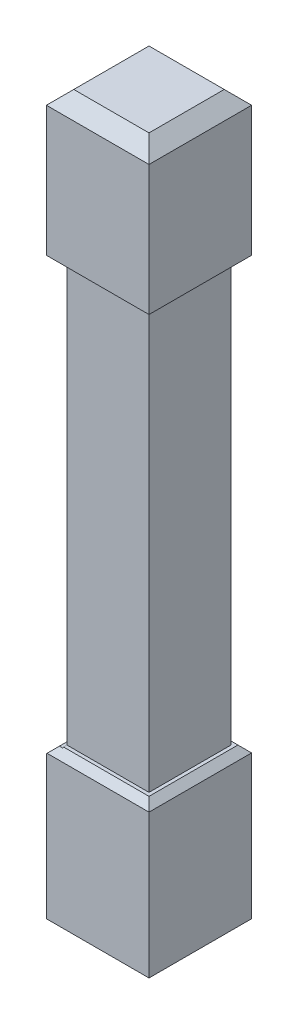
ISO-10303-21;
HEADER;
FILE_DESCRIPTION(('STEP AP214'),'2;1');
FILE_NAME('part.step','',(''),(''),'','','');
FILE_SCHEMA(('AUTOMOTIVE_DESIGN { 1 0 10303 214 1 1 1 1 }'));
ENDSEC;
DATA;
#1=APPLICATION_CONTEXT('core data for automotive mechanical design processes');
#2=APPLICATION_PROTOCOL_DEFINITION('international standard','automotive_design',2000,#1);
#3=PRODUCT_CONTEXT('',#1,'mechanical');
#4=PRODUCT('Part','Part','',(#3));
#5=PRODUCT_RELATED_PRODUCT_CATEGORY('part','',(#4));
#6=PRODUCT_DEFINITION_FORMATION('','',#4);
#7=PRODUCT_DEFINITION_CONTEXT('part definition',#1,'design');
#8=PRODUCT_DEFINITION('design','',#6,#7);
#9=PRODUCT_DEFINITION_SHAPE('','',#8);
#10=(LENGTH_UNIT() NAMED_UNIT(*) SI_UNIT(.MILLI.,.METRE.));
#11=(NAMED_UNIT(*) PLANE_ANGLE_UNIT() SI_UNIT($,.RADIAN.));
#12=(NAMED_UNIT(*) SI_UNIT($,.STERADIAN.) SOLID_ANGLE_UNIT());
#13=UNCERTAINTY_MEASURE_WITH_UNIT(LENGTH_MEASURE(1.E-05),#10,'distance_accuracy_value','');
#14=(GEOMETRIC_REPRESENTATION_CONTEXT(3) GLOBAL_UNCERTAINTY_ASSIGNED_CONTEXT((#13)) GLOBAL_UNIT_ASSIGNED_CONTEXT((#10,
#11,#12)) REPRESENTATION_CONTEXT('',''));
#15=CARTESIAN_POINT('',(0.,0.,0.));
#16=DIRECTION('',(0.,0.,1.));
#17=DIRECTION('',(1.,0.,0.));
#18=AXIS2_PLACEMENT_3D('',#15,#16,#17);
#19=CARTESIAN_POINT('',(0.,0.,150.));
#20=DIRECTION('',(0.,0.,-1.));
#21=DIRECTION('',(-1.,0.,0.));
#22=AXIS2_PLACEMENT_3D('',#19,#20,#21);
#23=PLANE('',#22);
#24=DIRECTION('',(0.,-1.,0.));
#25=VECTOR('',#24,1.);
#26=CARTESIAN_POINT('',(-75.,685.50971446118,150.));
#27=LINE('',#26,#25);
#28=CARTESIAN_POINT('',(-75.,665.50971446118,150.));
#29=VERTEX_POINT('',#28);
#30=CARTESIAN_POINT('',(-75.,475.50971446118,150.));
#31=VERTEX_POINT('',#30);
#32=EDGE_CURVE('E231',#29,#31,#27,.T.);
#33=ORIENTED_EDGE('',*,*,#32,.T.);
#34=DIRECTION('',(1.,0.,0.));
#35=VECTOR('',#34,1.);
#36=CARTESIAN_POINT('',(75.,475.50971446118,150.));
#37=LINE('',#36,#35);
#38=CARTESIAN_POINT('',(75.,475.50971446118,150.));
#39=VERTEX_POINT('',#38);
#40=EDGE_CURVE('E266',#31,#39,#37,.T.);
#41=ORIENTED_EDGE('',*,*,#40,.T.);
#42=DIRECTION('',(0.,-1.,0.));
#43=VECTOR('',#42,1.);
#44=CARTESIAN_POINT('',(75.,685.50971446118,150.));
#45=LINE('',#44,#43);
#46=CARTESIAN_POINT('',(75.,665.50971446118,150.));
#47=VERTEX_POINT('',#46);
#48=EDGE_CURVE('E220',#47,#39,#45,.T.);
#49=ORIENTED_EDGE('',*,*,#48,.F.);
#50=DIRECTION('',(-1.,0.,0.));
#51=VECTOR('',#50,1.);
#52=CARTESIAN_POINT('',(0.,665.50971446118,150.));
#53=LINE('',#52,#51);
#54=EDGE_CURVE('E264',#47,#29,#53,.T.);
#55=ORIENTED_EDGE('',*,*,#54,.T.);
#56=EDGE_LOOP('',(#33,#41,#49,#55));
#57=FACE_BOUND('',#56,.T.);
#58=ADVANCED_FACE('F33',(#57),#23,.F.);
#59=CARTESIAN_POINT('',(59.9999999999999,0.,0.));
#60=DIRECTION('',(-1.,0.,0.));
#61=DIRECTION('',(0.,-1.,0.));
#62=AXIS2_PLACEMENT_3D('',#59,#60,#61);
#63=PLANE('',#62);
#64=DIRECTION('',(0.,1.,0.));
#65=VECTOR('',#64,1.);
#66=CARTESIAN_POINT('',(59.9999999999999,0.,135.));
#67=LINE('',#66,#65);
#68=CARTESIAN_POINT('',(59.9999999999999,-144.49028553882,135.));
#69=VERTEX_POINT('',#68);
#70=CARTESIAN_POINT('',(59.9999999999999,465.50971446118,135.));
#71=VERTEX_POINT('',#70);
#72=EDGE_CURVE('E174',#69,#71,#67,.T.);
#73=ORIENTED_EDGE('',*,*,#72,.F.);
#74=DIRECTION('',(0.,0.,-1.));
#75=VECTOR('',#74,1.);
#76=CARTESIAN_POINT('',(59.9999999999999,-144.49028553882,0.));
#77=LINE('',#76,#75);
#78=CARTESIAN_POINT('',(59.9999999999999,-144.49028553882,15.));
#79=VERTEX_POINT('',#78);
#80=EDGE_CURVE('E200',#69,#79,#77,.T.);
#81=ORIENTED_EDGE('',*,*,#80,.T.);
#82=DIRECTION('',(0.,-1.,0.));
#83=VECTOR('',#82,1.);
#84=CARTESIAN_POINT('',(59.9999999999999,0.,15.));
#85=LINE('',#84,#83);
#86=CARTESIAN_POINT('',(60.,465.50971446118,15.));
#87=VERTEX_POINT('',#86);
#88=EDGE_CURVE('E199',#87,#79,#85,.T.);
#89=ORIENTED_EDGE('',*,*,#88,.F.);
#90=DIRECTION('',(0.,0.,1.));
#91=VECTOR('',#90,1.);
#92=CARTESIAN_POINT('',(60.,465.50971446118,0.));
#93=LINE('',#92,#91);
#94=EDGE_CURVE('E192',#87,#71,#93,.T.);
#95=ORIENTED_EDGE('',*,*,#94,.T.);
#96=EDGE_LOOP('',(#73,#81,#89,#95));
#97=FACE_BOUND('',#96,.T.);
#98=ADVANCED_FACE('F197',(#97),#63,.F.);
#99=CARTESIAN_POINT('',(75.,685.50971446118,150.));
#100=DIRECTION('',(1.,0.,0.));
#101=DIRECTION('',(0.,1.,0.));
#102=AXIS2_PLACEMENT_3D('',#99,#100,#101);
#103=PLANE('',#102);
#104=DIRECTION('',(0.,-1.,0.));
#105=VECTOR('',#104,1.);
#106=CARTESIAN_POINT('',(75.,685.50971446118,0.));
#107=LINE('',#106,#105);
#108=CARTESIAN_POINT('',(74.9999999999999,-154.49028553882,0.));
#109=VERTEX_POINT('',#108);
#110=CARTESIAN_POINT('',(74.9999999999999,-364.49028553882,0.));
#111=VERTEX_POINT('',#110);
#112=EDGE_CURVE('E219',#109,#111,#107,.T.);
#113=ORIENTED_EDGE('',*,*,#112,.F.);
#114=DIRECTION('',(0.,0.,1.));
#115=VECTOR('',#114,1.);
#116=CARTESIAN_POINT('',(74.9999999999999,-154.49028553882,150.));
#117=LINE('',#116,#115);
#118=CARTESIAN_POINT('',(74.9999999999999,-154.49028553882,150.));
#119=VERTEX_POINT('',#118);
#120=EDGE_CURVE('E11',#109,#119,#117,.T.);
#121=ORIENTED_EDGE('',*,*,#120,.T.);
#122=CARTESIAN_POINT('',(74.9999999999999,-364.49028553882,150.));
#123=VERTEX_POINT('',#122);
#124=EDGE_CURVE('E224',#119,#123,#45,.T.);
#125=ORIENTED_EDGE('',*,*,#124,.T.);
#126=DIRECTION('',(0.,0.,-1.));
#127=VECTOR('',#126,1.);
#128=CARTESIAN_POINT('',(74.9999999999999,-364.49028553882,150.));
#129=LINE('',#128,#127);
#130=EDGE_CURVE('E223',#123,#111,#129,.T.);
#131=ORIENTED_EDGE('',*,*,#130,.T.);
#132=EDGE_LOOP('',(#113,#121,#125,#131));
#133=FACE_BOUND('',#132,.T.);
#134=ADVANCED_FACE('F351',(#133),#103,.T.);
#135=CARTESIAN_POINT('',(-75.,685.50971446118,150.));
#136=DIRECTION('',(1.,0.,0.));
#137=DIRECTION('',(0.,1.,0.));
#138=AXIS2_PLACEMENT_3D('',#135,#136,#137);
#139=PLANE('',#138);
#140=DIRECTION('',(0.,-1.,0.));
#141=VECTOR('',#140,1.);
#142=CARTESIAN_POINT('',(-75.,685.50971446118,0.));
#143=LINE('',#142,#141);
#144=CARTESIAN_POINT('',(-75.,665.50971446118,0.));
#145=VERTEX_POINT('',#144);
#146=CARTESIAN_POINT('',(-75.,475.50971446118,0.));
#147=VERTEX_POINT('',#146);
#148=EDGE_CURVE('E239',#145,#147,#143,.T.);
#149=ORIENTED_EDGE('',*,*,#148,.T.);
#150=DIRECTION('',(0.,0.,1.));
#151=VECTOR('',#150,1.);
#152=CARTESIAN_POINT('',(-75.,475.50971446118,150.));
#153=LINE('',#152,#151);
#154=EDGE_CURVE('E289',#147,#31,#153,.T.);
#155=ORIENTED_EDGE('',*,*,#154,.T.);
#156=ORIENTED_EDGE('',*,*,#32,.F.);
#157=DIRECTION('',(0.,0.,-1.));
#158=VECTOR('',#157,1.);
#159=CARTESIAN_POINT('',(-75.,665.50971446118,150.));
#160=LINE('',#159,#158);
#161=EDGE_CURVE('E184',#29,#145,#160,.T.);
#162=ORIENTED_EDGE('',*,*,#161,.T.);
#163=EDGE_LOOP('',(#149,#155,#156,#162));
#164=FACE_BOUND('',#163,.T.);
#165=ADVANCED_FACE('F375',(#164),#139,.F.);
#166=CARTESIAN_POINT('',(-113.466713426682,-144.49028553882,15.));
#167=DIRECTION('',(0.,1.,0.));
#168=DIRECTION('',(0.,0.,1.));
#169=AXIS2_PLACEMENT_3D('',#166,#167,#168);
#170=PLANE('',#169);
#171=DIRECTION('',(0.,0.,1.));
#172=VECTOR('',#171,1.);
#173=CARTESIAN_POINT('',(-59.9999999999999,-144.49028553882,0.));
#174=LINE('',#173,#172);
#175=CARTESIAN_POINT('',(-59.9999999999999,-144.49028553882,135.));
#176=VERTEX_POINT('',#175);
#177=CARTESIAN_POINT('',(-59.9999999999999,-144.49028553882,140.));
#178=VERTEX_POINT('',#177);
#179=EDGE_CURVE('E201',#176,#178,#174,.T.);
#180=ORIENTED_EDGE('',*,*,#179,.T.);
#181=DIRECTION('',(1.,0.,0.));
#182=VECTOR('',#181,1.);
#183=CARTESIAN_POINT('',(74.9999999999999,-144.49028553882,140.));
#184=LINE('',#183,#182);
#185=CARTESIAN_POINT('',(65.,-144.49028553882,140.));
#186=VERTEX_POINT('',#185);
#187=EDGE_CURVE('E42',#178,#186,#184,.T.);
#188=ORIENTED_EDGE('',*,*,#187,.T.);
#189=DIRECTION('',(0.,0.,-1.));
#190=VECTOR('',#189,1.);
#191=CARTESIAN_POINT('',(65.,-144.49028553882,15.));
#192=LINE('',#191,#190);
#193=CARTESIAN_POINT('',(65.,-144.49028553882,9.9999999999999));
#194=VERTEX_POINT('',#193);
#195=EDGE_CURVE('E50',#186,#194,#192,.T.);
#196=ORIENTED_EDGE('',*,*,#195,.T.);
#197=DIRECTION('',(-1.,0.,0.));
#198=VECTOR('',#197,1.);
#199=CARTESIAN_POINT('',(-113.466713426682,-144.49028553882,9.9999999999999));
#200=LINE('',#199,#198);
#201=CARTESIAN_POINT('',(-59.9999999999999,-144.49028553882,9.99999999999988));
#202=VERTEX_POINT('',#201);
#203=EDGE_CURVE('E327',#194,#202,#200,.T.);
#204=ORIENTED_EDGE('',*,*,#203,.T.);
#205=DIRECTION('',(0.,0.,1.));
#206=VECTOR('',#205,1.);
#207=CARTESIAN_POINT('',(-59.9999999999999,-144.49028553882,15.));
#208=LINE('',#207,#206);
#209=CARTESIAN_POINT('',(-59.9999999999999,-144.49028553882,15.));
#210=VERTEX_POINT('',#209);
#211=EDGE_CURVE('E212',#202,#210,#208,.T.);
#212=ORIENTED_EDGE('',*,*,#211,.T.);
#213=DIRECTION('',(1.,0.,0.));
#214=VECTOR('',#213,1.);
#215=CARTESIAN_POINT('',(-113.466713426682,-144.49028553882,15.));
#216=LINE('',#215,#214);
#217=EDGE_CURVE('E214',#210,#79,#216,.T.);
#218=ORIENTED_EDGE('',*,*,#217,.T.);
#219=ORIENTED_EDGE('',*,*,#80,.F.);
#220=DIRECTION('',(1.,0.,0.));
#221=VECTOR('',#220,1.);
#222=CARTESIAN_POINT('',(-75.,-144.49028553882,135.));
#223=LINE('',#222,#221);
#224=EDGE_CURVE('E180',#176,#69,#223,.T.);
#225=ORIENTED_EDGE('',*,*,#224,.F.);
#226=EDGE_LOOP('',(#180,#188,#196,#204,#212,#218,#219,#225));
#227=FACE_BOUND('',#226,.T.);
#228=ADVANCED_FACE('F382',(#227),#170,.T.);
#229=CARTESIAN_POINT('',(0.,0.,15.));
#230=DIRECTION('',(0.,0.,1.));
#231=DIRECTION('',(1.,0.,0.));
#232=AXIS2_PLACEMENT_3D('',#229,#230,#231);
#233=PLANE('',#232);
#234=DIRECTION('',(-1.,0.,0.));
#235=VECTOR('',#234,1.);
#236=CARTESIAN_POINT('',(-113.466713426682,465.50971446118,15.));
#237=LINE('',#236,#235);
#238=CARTESIAN_POINT('',(-59.9999999999999,465.50971446118,15.));
#239=VERTEX_POINT('',#238);
#240=EDGE_CURVE('E217',#87,#239,#237,.T.);
#241=ORIENTED_EDGE('',*,*,#240,.F.);
#242=ORIENTED_EDGE('',*,*,#88,.T.);
#243=ORIENTED_EDGE('',*,*,#217,.F.);
#244=DIRECTION('',(0.,-1.,0.));
#245=VECTOR('',#244,1.);
#246=CARTESIAN_POINT('',(-59.9999999999999,0.,15.));
#247=LINE('',#246,#245);
#248=EDGE_CURVE('E185',#239,#210,#247,.T.);
#249=ORIENTED_EDGE('',*,*,#248,.F.);
#250=EDGE_LOOP('',(#241,#242,#243,#249));
#251=FACE_BOUND('',#250,.T.);
#252=ADVANCED_FACE('F373',(#251),#233,.F.);
#253=CARTESIAN_POINT('',(-74.9999999999999,-155.454753629386,150.));
#254=VERTEX_POINT('',#253);
#255=CARTESIAN_POINT('',(-74.9999999999999,-364.49028553882,150.));
#256=VERTEX_POINT('',#255);
#257=EDGE_CURVE('E235',#254,#256,#27,.T.);
#258=ORIENTED_EDGE('',*,*,#257,.F.);
#259=DIRECTION('',(0.,0.,-1.));
#260=VECTOR('',#259,1.);
#261=CARTESIAN_POINT('',(-74.9999999999999,-155.454753629386,150.));
#262=LINE('',#261,#260);
#263=CARTESIAN_POINT('',(-74.9999999999999,-155.454753629386,0.));
#264=VERTEX_POINT('',#263);
#265=EDGE_CURVE('E315',#254,#264,#262,.T.);
#266=ORIENTED_EDGE('',*,*,#265,.T.);
#267=CARTESIAN_POINT('',(-74.9999999999999,-364.49028553882,0.));
#268=VERTEX_POINT('',#267);
#269=EDGE_CURVE('E230',#264,#268,#143,.T.);
#270=ORIENTED_EDGE('',*,*,#269,.T.);
#271=DIRECTION('',(0.,0.,-1.));
#272=VECTOR('',#271,1.);
#273=CARTESIAN_POINT('',(-74.9999999999999,-364.49028553882,150.));
#274=LINE('',#273,#272);
#275=EDGE_CURVE('E238',#256,#268,#274,.T.);
#276=ORIENTED_EDGE('',*,*,#275,.F.);
#277=EDGE_LOOP('',(#258,#266,#270,#276));
#278=FACE_BOUND('',#277,.T.);
#279=ADVANCED_FACE('F371',(#278),#139,.F.);
#280=CARTESIAN_POINT('',(0.,0.,0.));
#281=DIRECTION('',(0.,0.,-1.));
#282=DIRECTION('',(-1.,0.,0.));
#283=AXIS2_PLACEMENT_3D('',#280,#281,#282);
#284=PLANE('',#283);
#285=ORIENTED_EDGE('',*,*,#269,.F.);
#286=DIRECTION('',(-0.707106781186544,-0.707106781186551,0.));
#287=VECTOR('',#286,1.);
#288=CARTESIAN_POINT('',(40.2273768146925,-40.2273768146921,0.));
#289=LINE('',#288,#287);
#290=CARTESIAN_POINT('',(-74.0355319094341,-154.49028553882,0.));
#291=VERTEX_POINT('',#290);
#292=EDGE_CURVE('E320',#264,#291,#289,.F.);
#293=ORIENTED_EDGE('',*,*,#292,.T.);
#294=DIRECTION('',(1.,0.,0.));
#295=VECTOR('',#294,1.);
#296=CARTESIAN_POINT('',(0.,-154.49028553882,0.));
#297=LINE('',#296,#295);
#298=EDGE_CURVE('E318',#291,#109,#297,.T.);
#299=ORIENTED_EDGE('',*,*,#298,.T.);
#300=ORIENTED_EDGE('',*,*,#112,.T.);
#301=DIRECTION('',(1.,0.,0.));
#302=VECTOR('',#301,1.);
#303=CARTESIAN_POINT('',(0.,-364.49028553882,0.));
#304=LINE('',#303,#302);
#305=EDGE_CURVE('E242',#268,#111,#304,.T.);
#306=ORIENTED_EDGE('',*,*,#305,.F.);
#307=EDGE_LOOP('',(#285,#293,#299,#300,#306));
#308=FACE_BOUND('',#307,.T.);
#309=ADVANCED_FACE('F364',(#308),#284,.T.);
#310=CARTESIAN_POINT('',(75.,665.50971446118,0.));
#311=VERTEX_POINT('',#310);
#312=CARTESIAN_POINT('',(75.,475.50971446118,0.));
#313=VERTEX_POINT('',#312);
#314=EDGE_CURVE('E225',#311,#313,#107,.T.);
#315=ORIENTED_EDGE('',*,*,#314,.T.);
#316=DIRECTION('',(-1.,0.,0.));
#317=VECTOR('',#316,1.);
#318=CARTESIAN_POINT('',(0.,475.50971446118,0.));
#319=LINE('',#318,#317);
#320=EDGE_CURVE('E291',#313,#147,#319,.T.);
#321=ORIENTED_EDGE('',*,*,#320,.T.);
#322=ORIENTED_EDGE('',*,*,#148,.F.);
#323=DIRECTION('',(1.,0.,0.));
#324=VECTOR('',#323,1.);
#325=CARTESIAN_POINT('',(75.,665.50971446118,0.));
#326=LINE('',#325,#324);
#327=EDGE_CURVE('E260',#145,#311,#326,.T.);
#328=ORIENTED_EDGE('',*,*,#327,.T.);
#329=EDGE_LOOP('',(#315,#321,#322,#328));
#330=FACE_BOUND('',#329,.T.);
#331=ADVANCED_FACE('F380',(#330),#284,.T.);
#332=ORIENTED_EDGE('',*,*,#48,.T.);
#333=DIRECTION('',(0.,0.,-1.));
#334=VECTOR('',#333,1.);
#335=CARTESIAN_POINT('',(75.,475.50971446118,150.));
#336=LINE('',#335,#334);
#337=EDGE_CURVE('E293',#39,#313,#336,.T.);
#338=ORIENTED_EDGE('',*,*,#337,.T.);
#339=ORIENTED_EDGE('',*,*,#314,.F.);
#340=DIRECTION('',(0.,0.,1.));
#341=VECTOR('',#340,1.);
#342=CARTESIAN_POINT('',(75.,665.50971446118,150.));
#343=LINE('',#342,#341);
#344=EDGE_CURVE('E262',#311,#47,#343,.T.);
#345=ORIENTED_EDGE('',*,*,#344,.T.);
#346=EDGE_LOOP('',(#332,#338,#339,#345));
#347=FACE_BOUND('',#346,.T.);
#348=ADVANCED_FACE('F409',(#347),#103,.T.);
#349=CARTESIAN_POINT('',(0.,685.50971446118,150.));
#350=DIRECTION('',(0.,-1.,0.));
#351=DIRECTION('',(0.,0.,-1.));
#352=AXIS2_PLACEMENT_3D('',#349,#350,#351);
#353=PLANE('',#352);
#354=DIRECTION('',(-1.,0.,0.));
#355=VECTOR('',#354,1.);
#356=CARTESIAN_POINT('',(-75.,685.50971446118,20.));
#357=LINE('',#356,#355);
#358=CARTESIAN_POINT('',(55.,685.50971446118,20.));
#359=VERTEX_POINT('',#358);
#360=CARTESIAN_POINT('',(-55.,685.50971446118,20.));
#361=VERTEX_POINT('',#360);
#362=EDGE_CURVE('E255',#359,#361,#357,.T.);
#363=ORIENTED_EDGE('',*,*,#362,.T.);
#364=DIRECTION('',(0.,0.,1.));
#365=VECTOR('',#364,1.);
#366=CARTESIAN_POINT('',(-55.,685.50971446118,150.));
#367=LINE('',#366,#365);
#368=CARTESIAN_POINT('',(-55.,685.50971446118,130.));
#369=VERTEX_POINT('',#368);
#370=EDGE_CURVE('E257',#361,#369,#367,.T.);
#371=ORIENTED_EDGE('',*,*,#370,.T.);
#372=DIRECTION('',(1.,0.,0.));
#373=VECTOR('',#372,1.);
#374=CARTESIAN_POINT('',(0.,685.50971446118,130.));
#375=LINE('',#374,#373);
#376=CARTESIAN_POINT('',(55.,685.50971446118,130.));
#377=VERTEX_POINT('',#376);
#378=EDGE_CURVE('E251',#369,#377,#375,.T.);
#379=ORIENTED_EDGE('',*,*,#378,.T.);
#380=DIRECTION('',(0.,0.,-1.));
#381=VECTOR('',#380,1.);
#382=CARTESIAN_POINT('',(55.,685.50971446118,0.));
#383=LINE('',#382,#381);
#384=EDGE_CURVE('E253',#377,#359,#383,.T.);
#385=ORIENTED_EDGE('',*,*,#384,.T.);
#386=EDGE_LOOP('',(#363,#371,#379,#385));
#387=FACE_BOUND('',#386,.T.);
#388=ADVANCED_FACE('F405',(#387),#353,.F.);
#389=CARTESIAN_POINT('',(0.,-364.49028553882,150.));
#390=DIRECTION('',(0.,1.,0.));
#391=DIRECTION('',(-1.,0.,0.));
#392=AXIS2_PLACEMENT_3D('',#389,#390,#391);
#393=PLANE('',#392);
#394=ORIENTED_EDGE('',*,*,#305,.T.);
#395=ORIENTED_EDGE('',*,*,#130,.F.);
#396=DIRECTION('',(1.,0.,0.));
#397=VECTOR('',#396,1.);
#398=CARTESIAN_POINT('',(0.,-364.49028553882,150.));
#399=LINE('',#398,#397);
#400=EDGE_CURVE('E234',#256,#123,#399,.T.);
#401=ORIENTED_EDGE('',*,*,#400,.F.);
#402=ORIENTED_EDGE('',*,*,#275,.T.);
#403=EDGE_LOOP('',(#394,#395,#401,#402));
#404=FACE_BOUND('',#403,.T.);
#405=ADVANCED_FACE('F360',(#404),#393,.F.);
#406=DIRECTION('',(-1.,0.,0.));
#407=VECTOR('',#406,1.);
#408=CARTESIAN_POINT('',(-59.9999999999999,-154.49028553882,150.));
#409=LINE('',#408,#407);
#410=CARTESIAN_POINT('',(-74.0355319094341,-154.49028553882,150.));
#411=VERTEX_POINT('',#410);
#412=EDGE_CURVE('E311',#119,#411,#409,.T.);
#413=ORIENTED_EDGE('',*,*,#412,.T.);
#414=DIRECTION('',(0.707106781186544,0.707106781186551,0.));
#415=VECTOR('',#414,1.);
#416=CARTESIAN_POINT('',(-65.,-145.454753629386,150.));
#417=LINE('',#416,#415);
#418=EDGE_CURVE('E313',#411,#254,#417,.F.);
#419=ORIENTED_EDGE('',*,*,#418,.T.);
#420=ORIENTED_EDGE('',*,*,#257,.T.);
#421=ORIENTED_EDGE('',*,*,#400,.T.);
#422=ORIENTED_EDGE('',*,*,#124,.F.);
#423=EDGE_LOOP('',(#413,#419,#420,#421,#422));
#424=FACE_BOUND('',#423,.T.);
#425=ADVANCED_FACE('F353',(#424),#23,.F.);
#426=CARTESIAN_POINT('',(-113.466713426682,465.50971446118,15.));
#427=DIRECTION('',(0.,-1.,0.));
#428=DIRECTION('',(0.,0.,-1.));
#429=AXIS2_PLACEMENT_3D('',#426,#427,#428);
#430=PLANE('',#429);
#431=DIRECTION('',(0.,0.,1.));
#432=VECTOR('',#431,1.);
#433=CARTESIAN_POINT('',(64.9999999999998,465.50971446118,15.));
#434=LINE('',#433,#432);
#435=CARTESIAN_POINT('',(64.9999999999998,465.50971446118,10.0000000000001));
#436=VERTEX_POINT('',#435);
#437=CARTESIAN_POINT('',(64.9999999999998,465.50971446118,140.));
#438=VERTEX_POINT('',#437);
#439=EDGE_CURVE('E280',#436,#438,#434,.T.);
#440=ORIENTED_EDGE('',*,*,#439,.T.);
#441=DIRECTION('',(-1.,0.,0.));
#442=VECTOR('',#441,1.);
#443=CARTESIAN_POINT('',(-75.,465.50971446118,140.));
#444=LINE('',#443,#442);
#445=CARTESIAN_POINT('',(-64.9999999999998,465.50971446118,140.));
#446=VERTEX_POINT('',#445);
#447=EDGE_CURVE('E286',#438,#446,#444,.T.);
#448=ORIENTED_EDGE('',*,*,#447,.T.);
#449=DIRECTION('',(0.,0.,-1.));
#450=VECTOR('',#449,1.);
#451=CARTESIAN_POINT('',(-64.9999999999998,465.50971446118,0.));
#452=LINE('',#451,#450);
#453=CARTESIAN_POINT('',(-64.9999999999998,465.50971446118,10.0000000000001));
#454=VERTEX_POINT('',#453);
#455=EDGE_CURVE('E284',#446,#454,#452,.T.);
#456=ORIENTED_EDGE('',*,*,#455,.T.);
#457=DIRECTION('',(1.,0.,0.));
#458=VECTOR('',#457,1.);
#459=CARTESIAN_POINT('',(-113.466713426682,465.50971446118,10.0000000000001));
#460=LINE('',#459,#458);
#461=EDGE_CURVE('E282',#454,#436,#460,.T.);
#462=ORIENTED_EDGE('',*,*,#461,.T.);
#463=EDGE_LOOP('',(#440,#448,#456,#462));
#464=FACE_BOUND('',#463,.T.);
#465=DIRECTION('',(-1.,0.,0.));
#466=VECTOR('',#465,1.);
#467=CARTESIAN_POINT('',(-75.,465.50971446118,135.));
#468=LINE('',#467,#466);
#469=CARTESIAN_POINT('',(-59.9999999999999,465.50971446118,135.));
#470=VERTEX_POINT('',#469);
#471=EDGE_CURVE('E177',#71,#470,#468,.T.);
#472=ORIENTED_EDGE('',*,*,#471,.F.);
#473=ORIENTED_EDGE('',*,*,#94,.F.);
#474=ORIENTED_EDGE('',*,*,#240,.T.);
#475=DIRECTION('',(0.,0.,-1.));
#476=VECTOR('',#475,1.);
#477=CARTESIAN_POINT('',(-60.,465.50971446118,0.));
#478=LINE('',#477,#476);
#479=EDGE_CURVE('E194',#470,#239,#478,.T.);
#480=ORIENTED_EDGE('',*,*,#479,.F.);
#481=EDGE_LOOP('',(#472,#473,#474,#480));
#482=FACE_BOUND('',#481,.T.);
#483=ADVANCED_FACE('F190',(#464,#482),#430,.T.);
#484=CARTESIAN_POINT('',(-59.9999999999999,-145.454753629386,0.));
#485=DIRECTION('',(0.,-1.,0.));
#486=DIRECTION('',(1.,0.,0.));
#487=AXIS2_PLACEMENT_3D('',#484,#485,#486);
#488=PLANE('',#487);
#489=DIRECTION('',(0.,0.,1.));
#490=VECTOR('',#489,1.);
#491=CARTESIAN_POINT('',(-65.,-145.454753629386,0.));
#492=LINE('',#491,#490);
#493=CARTESIAN_POINT('',(-65.,-145.454753629386,9.03553190943418));
#494=VERTEX_POINT('',#493);
#495=CARTESIAN_POINT('',(-65.,-145.454753629386,140.964468090566));
#496=VERTEX_POINT('',#495);
#497=EDGE_CURVE('E306',#494,#496,#492,.T.);
#498=ORIENTED_EDGE('',*,*,#497,.T.);
#499=DIRECTION('',(1.,0.,0.));
#500=VECTOR('',#499,1.);
#501=CARTESIAN_POINT('',(0.,-145.454753629386,140.964468090566));
#502=LINE('',#501,#500);
#503=CARTESIAN_POINT('',(-59.9999999999999,-145.454753629386,140.964468090566));
#504=VERTEX_POINT('',#503);
#505=EDGE_CURVE('E309',#496,#504,#502,.T.);
#506=ORIENTED_EDGE('',*,*,#505,.T.);
#507=DIRECTION('',(0.,0.,1.));
#508=VECTOR('',#507,1.);
#509=CARTESIAN_POINT('',(-59.9999999999999,-145.454753629386,0.));
#510=LINE('',#509,#508);
#511=CARTESIAN_POINT('',(-59.9999999999999,-145.454753629386,9.03553190943418));
#512=VERTEX_POINT('',#511);
#513=EDGE_CURVE('E208',#512,#504,#510,.T.);
#514=ORIENTED_EDGE('',*,*,#513,.F.);
#515=DIRECTION('',(1.,0.,0.));
#516=VECTOR('',#515,1.);
#517=CARTESIAN_POINT('',(0.,-145.454753629386,9.03553190943419));
#518=LINE('',#517,#516);
#519=EDGE_CURVE('E295',#512,#494,#518,.F.);
#520=ORIENTED_EDGE('',*,*,#519,.T.);
#521=EDGE_LOOP('',(#498,#506,#514,#520));
#522=FACE_BOUND('',#521,.T.);
#523=ADVANCED_FACE('F402',(#522),#488,.F.);
#524=CARTESIAN_POINT('',(-59.9999999999999,0.,0.));
#525=DIRECTION('',(-1.,0.,0.));
#526=DIRECTION('',(0.,-1.,0.));
#527=AXIS2_PLACEMENT_3D('',#524,#525,#526);
#528=PLANE('',#527);
#529=ORIENTED_EDGE('',*,*,#513,.T.);
#530=DIRECTION('',(0.,0.707106781186549,-0.707106781186547));
#531=VECTOR('',#530,1.);
#532=CARTESIAN_POINT('',(-59.9999999999999,-2.24514276940976,-2.24514276940976));
#533=LINE('',#532,#531);
#534=EDGE_CURVE('E324',#504,#178,#533,.T.);
#535=ORIENTED_EDGE('',*,*,#534,.T.);
#536=ORIENTED_EDGE('',*,*,#179,.F.);
#537=DIRECTION('',(0.,1.,0.));
#538=VECTOR('',#537,1.);
#539=CARTESIAN_POINT('',(-59.9999999999999,0.,135.));
#540=LINE('',#539,#538);
#541=EDGE_CURVE('E195',#176,#470,#540,.T.);
#542=ORIENTED_EDGE('',*,*,#541,.T.);
#543=ORIENTED_EDGE('',*,*,#479,.T.);
#544=ORIENTED_EDGE('',*,*,#248,.T.);
#545=ORIENTED_EDGE('',*,*,#211,.F.);
#546=DIRECTION('',(0.,0.707106781186548,0.707106781186548));
#547=VECTOR('',#546,1.);
#548=CARTESIAN_POINT('',(-59.9999999999999,-77.24514276941,77.24514276941));
#549=LINE('',#548,#547);
#550=EDGE_CURVE('E322',#202,#512,#549,.F.);
#551=ORIENTED_EDGE('',*,*,#550,.T.);
#552=EDGE_LOOP('',(#529,#535,#536,#542,#543,#544,#545,#551));
#553=FACE_BOUND('',#552,.T.);
#554=ADVANCED_FACE('F499',(#553),#528,.T.);
#555=CARTESIAN_POINT('',(0.,0.,135.));
#556=DIRECTION('',(0.,0.,1.));
#557=DIRECTION('',(1.,0.,0.));
#558=AXIS2_PLACEMENT_3D('',#555,#556,#557);
#559=PLANE('',#558);
#560=ORIENTED_EDGE('',*,*,#224,.T.);
#561=ORIENTED_EDGE('',*,*,#72,.T.);
#562=ORIENTED_EDGE('',*,*,#471,.T.);
#563=ORIENTED_EDGE('',*,*,#541,.F.);
#564=EDGE_LOOP('',(#560,#561,#562,#563));
#565=FACE_BOUND('',#564,.T.);
#566=ADVANCED_FACE('F176',(#565),#559,.T.);
#567=CARTESIAN_POINT('',(55.,685.50971446118,150.));
#568=DIRECTION('',(0.707106781186544,0.707106781186551,0.));
#569=DIRECTION('',(0.,0.,1.));
#570=AXIS2_PLACEMENT_3D('',#567,#568,#569);
#571=PLANE('',#570);
#572=DIRECTION('',(-0.577350269189628,0.577350269189621,0.577350269189628));
#573=VECTOR('',#572,1.);
#574=CARTESIAN_POINT('',(11.6666666666663,728.843047794513,63.3333333333337));
#575=LINE('',#574,#573);
#576=EDGE_CURVE('E272',#359,#311,#575,.F.);
#577=ORIENTED_EDGE('',*,*,#576,.F.);
#578=ORIENTED_EDGE('',*,*,#384,.F.);
#579=DIRECTION('',(0.577350269189628,-0.577350269189621,0.577350269189628));
#580=VECTOR('',#579,1.);
#581=CARTESIAN_POINT('',(49.9999999999998,690.50971446118,125.));
#582=LINE('',#581,#580);
#583=EDGE_CURVE('E275',#47,#377,#582,.F.);
#584=ORIENTED_EDGE('',*,*,#583,.F.);
#585=ORIENTED_EDGE('',*,*,#344,.F.);
#586=EDGE_LOOP('',(#577,#578,#584,#585));
#587=FACE_BOUND('',#586,.T.);
#588=ADVANCED_FACE('F428',(#587),#571,.T.);
#589=CARTESIAN_POINT('',(0.,665.50971446118,150.));
#590=DIRECTION('',(0.,-0.707106781186551,-0.707106781186544));
#591=DIRECTION('',(-1.,0.,0.));
#592=AXIS2_PLACEMENT_3D('',#589,#590,#591);
#593=PLANE('',#592);
#594=ORIENTED_EDGE('',*,*,#583,.T.);
#595=ORIENTED_EDGE('',*,*,#378,.F.);
#596=DIRECTION('',(-0.577350269189628,-0.577350269189621,0.577350269189628));
#597=VECTOR('',#596,1.);
#598=CARTESIAN_POINT('',(-49.9999999999998,690.50971446118,125.));
#599=LINE('',#598,#597);
#600=EDGE_CURVE('E269',#29,#369,#599,.F.);
#601=ORIENTED_EDGE('',*,*,#600,.F.);
#602=ORIENTED_EDGE('',*,*,#54,.F.);
#603=EDGE_LOOP('',(#594,#595,#601,#602));
#604=FACE_BOUND('',#603,.T.);
#605=ADVANCED_FACE('F424',(#604),#593,.F.);
#606=CARTESIAN_POINT('',(0.,685.50971446118,20.));
#607=DIRECTION('',(0.,0.707106781186551,-0.707106781186544));
#608=DIRECTION('',(1.,0.,0.));
#609=AXIS2_PLACEMENT_3D('',#606,#607,#608);
#610=PLANE('',#609);
#611=ORIENTED_EDGE('',*,*,#576,.T.);
#612=ORIENTED_EDGE('',*,*,#327,.F.);
#613=DIRECTION('',(-0.577350269189628,-0.577350269189621,-0.577350269189628));
#614=VECTOR('',#613,1.);
#615=CARTESIAN_POINT('',(-36.6666666666665,703.843047794513,38.3333333333335));
#616=LINE('',#615,#614);
#617=EDGE_CURVE('E267',#361,#145,#616,.T.);
#618=ORIENTED_EDGE('',*,*,#617,.F.);
#619=ORIENTED_EDGE('',*,*,#362,.F.);
#620=EDGE_LOOP('',(#611,#612,#618,#619));
#621=FACE_BOUND('',#620,.T.);
#622=ADVANCED_FACE('F420',(#621),#610,.T.);
#623=CARTESIAN_POINT('',(-75.,665.50971446118,150.));
#624=DIRECTION('',(0.707106781186544,-0.707106781186551,0.));
#625=DIRECTION('',(0.,0.,-1.));
#626=AXIS2_PLACEMENT_3D('',#623,#624,#625);
#627=PLANE('',#626);
#628=ORIENTED_EDGE('',*,*,#600,.T.);
#629=ORIENTED_EDGE('',*,*,#370,.F.);
#630=ORIENTED_EDGE('',*,*,#617,.T.);
#631=ORIENTED_EDGE('',*,*,#161,.F.);
#632=EDGE_LOOP('',(#628,#629,#630,#631));
#633=FACE_BOUND('',#632,.T.);
#634=ADVANCED_FACE('F416',(#633),#627,.F.);
#635=CARTESIAN_POINT('',(0.,475.50971446118,0.));
#636=DIRECTION('',(0.,0.707106781186551,0.707106781186543));
#637=DIRECTION('',(-1.,0.,0.));
#638=AXIS2_PLACEMENT_3D('',#635,#636,#637);
#639=PLANE('',#638);
#640=DIRECTION('',(0.577350269189628,0.577350269189622,-0.577350269189628));
#641=VECTOR('',#640,1.);
#642=CARTESIAN_POINT('',(24.9999999999996,425.50971446118,50.0000000000004));
#643=LINE('',#642,#641);
#644=EDGE_CURVE('E300',#436,#313,#643,.T.);
#645=ORIENTED_EDGE('',*,*,#644,.F.);
#646=ORIENTED_EDGE('',*,*,#461,.F.);
#647=DIRECTION('',(0.577350269189628,-0.577350269189622,0.577350269189628));
#648=VECTOR('',#647,1.);
#649=CARTESIAN_POINT('',(-49.9999999999998,450.50971446118,25.0000000000002));
#650=LINE('',#649,#648);
#651=EDGE_CURVE('E270',#147,#454,#650,.T.);
#652=ORIENTED_EDGE('',*,*,#651,.F.);
#653=ORIENTED_EDGE('',*,*,#320,.F.);
#654=EDGE_LOOP('',(#645,#646,#652,#653));
#655=FACE_BOUND('',#654,.T.);
#656=ADVANCED_FACE('F419',(#655),#639,.F.);
#657=CARTESIAN_POINT('',(-64.9999999999998,465.50971446118,15.));
#658=DIRECTION('',(-0.707106781186543,-0.707106781186551,0.));
#659=DIRECTION('',(0.,0.,1.));
#660=AXIS2_PLACEMENT_3D('',#657,#658,#659);
#661=PLANE('',#660);
#662=ORIENTED_EDGE('',*,*,#651,.T.);
#663=ORIENTED_EDGE('',*,*,#455,.F.);
#664=DIRECTION('',(-0.577350269189628,0.577350269189622,0.577350269189628));
#665=VECTOR('',#664,1.);
#666=CARTESIAN_POINT('',(-23.3333333333329,423.843047794513,98.333333333333));
#667=LINE('',#666,#665);
#668=EDGE_CURVE('E298',#31,#446,#667,.F.);
#669=ORIENTED_EDGE('',*,*,#668,.F.);
#670=ORIENTED_EDGE('',*,*,#154,.F.);
#671=EDGE_LOOP('',(#662,#663,#669,#670));
#672=FACE_BOUND('',#671,.T.);
#673=ADVANCED_FACE('F440',(#672),#661,.T.);
#674=CARTESIAN_POINT('',(75.,475.50971446118,150.));
#675=DIRECTION('',(-0.707106781186543,0.707106781186551,0.));
#676=DIRECTION('',(0.,0.,-1.));
#677=AXIS2_PLACEMENT_3D('',#674,#675,#676);
#678=PLANE('',#677);
#679=ORIENTED_EDGE('',*,*,#644,.T.);
#680=ORIENTED_EDGE('',*,*,#337,.F.);
#681=DIRECTION('',(0.577350269189628,0.577350269189622,0.577350269189628));
#682=VECTOR('',#681,1.);
#683=CARTESIAN_POINT('',(75.,475.50971446118,150.));
#684=LINE('',#683,#682);
#685=EDGE_CURVE('E296',#438,#39,#684,.T.);
#686=ORIENTED_EDGE('',*,*,#685,.F.);
#687=ORIENTED_EDGE('',*,*,#439,.F.);
#688=EDGE_LOOP('',(#679,#680,#686,#687));
#689=FACE_BOUND('',#688,.T.);
#690=ADVANCED_FACE('F436',(#689),#678,.F.);
#691=CARTESIAN_POINT('',(0.,475.50971446118,150.));
#692=DIRECTION('',(0.,-0.707106781186551,0.707106781186543));
#693=DIRECTION('',(-1.,0.,0.));
#694=AXIS2_PLACEMENT_3D('',#691,#692,#693);
#695=PLANE('',#694);
#696=ORIENTED_EDGE('',*,*,#668,.T.);
#697=ORIENTED_EDGE('',*,*,#447,.F.);
#698=ORIENTED_EDGE('',*,*,#685,.T.);
#699=ORIENTED_EDGE('',*,*,#40,.F.);
#700=EDGE_LOOP('',(#696,#697,#698,#699));
#701=FACE_BOUND('',#700,.T.);
#702=ADVANCED_FACE('F433',(#701),#695,.T.);
#703=CARTESIAN_POINT('',(74.9999999999999,-154.49028553882,150.));
#704=DIRECTION('',(-0.707106781186547,-0.707106781186547,0.));
#705=DIRECTION('',(0.,0.,1.));
#706=AXIS2_PLACEMENT_3D('',#703,#704,#705);
#707=PLANE('',#706);
#708=DIRECTION('',(-0.577350269189626,0.577350269189626,-0.577350269189625));
#709=VECTOR('',#708,1.);
#710=CARTESIAN_POINT('',(74.9999999999999,-154.49028553882,150.));
#711=LINE('',#710,#709);
#712=EDGE_CURVE('E334',#119,#186,#711,.T.);
#713=ORIENTED_EDGE('',*,*,#712,.F.);
#714=ORIENTED_EDGE('',*,*,#120,.F.);
#715=DIRECTION('',(-0.577350269189626,0.577350269189626,0.577350269189626));
#716=VECTOR('',#715,1.);
#717=CARTESIAN_POINT('',(24.9999999999999,-104.49028553882,50.));
#718=LINE('',#717,#716);
#719=EDGE_CURVE('E37',#194,#109,#718,.F.);
#720=ORIENTED_EDGE('',*,*,#719,.F.);
#721=ORIENTED_EDGE('',*,*,#195,.F.);
#722=EDGE_LOOP('',(#713,#714,#720,#721));
#723=FACE_BOUND('',#722,.T.);
#724=ADVANCED_FACE('F35',(#723),#707,.F.);
#725=CARTESIAN_POINT('',(0.,-154.49028553882,0.));
#726=DIRECTION('',(0.,-0.707106781186547,0.707106781186547));
#727=DIRECTION('',(1.,0.,0.));
#728=AXIS2_PLACEMENT_3D('',#725,#726,#727);
#729=PLANE('',#728);
#730=ORIENTED_EDGE('',*,*,#719,.T.);
#731=ORIENTED_EDGE('',*,*,#298,.F.);
#732=DIRECTION('',(0.577350269189622,0.577350269189628,0.577350269189628));
#733=VECTOR('',#732,1.);
#734=CARTESIAN_POINT('',(-49.3570212729564,-129.811774902342,24.6785106364779));
#735=LINE('',#734,#733);
#736=EDGE_CURVE('E332',#494,#291,#735,.F.);
#737=ORIENTED_EDGE('',*,*,#736,.F.);
#738=ORIENTED_EDGE('',*,*,#519,.F.);
#739=ORIENTED_EDGE('',*,*,#550,.F.);
#740=ORIENTED_EDGE('',*,*,#203,.F.);
#741=EDGE_LOOP('',(#730,#731,#737,#738,#739,#740));
#742=FACE_BOUND('',#741,.T.);
#743=ADVANCED_FACE('F343',(#742),#729,.F.);
#744=CARTESIAN_POINT('',(0.,-154.49028553882,150.));
#745=DIRECTION('',(0.,0.707106781186546,0.707106781186548));
#746=DIRECTION('',(1.,0.,0.));
#747=AXIS2_PLACEMENT_3D('',#744,#745,#746);
#748=PLANE('',#747);
#749=ORIENTED_EDGE('',*,*,#534,.F.);
#750=ORIENTED_EDGE('',*,*,#505,.F.);
#751=DIRECTION('',(-0.577350269189622,-0.577350269189629,0.577350269189627));
#752=VECTOR('',#751,1.);
#753=CARTESIAN_POINT('',(-18.0118439698116,-98.4665975991968,93.9763120603771));
#754=LINE('',#753,#752);
#755=EDGE_CURVE('E330',#411,#496,#754,.F.);
#756=ORIENTED_EDGE('',*,*,#755,.F.);
#757=ORIENTED_EDGE('',*,*,#412,.F.);
#758=ORIENTED_EDGE('',*,*,#712,.T.);
#759=ORIENTED_EDGE('',*,*,#187,.F.);
#760=EDGE_LOOP('',(#749,#750,#756,#757,#758,#759));
#761=FACE_BOUND('',#760,.T.);
#762=ADVANCED_FACE('F450',(#761),#748,.T.);
#763=CARTESIAN_POINT('',(-65.,-145.454753629386,0.));
#764=DIRECTION('',(0.707106781186551,-0.707106781186544,0.));
#765=DIRECTION('',(0.,0.,1.));
#766=AXIS2_PLACEMENT_3D('',#763,#764,#765);
#767=PLANE('',#766);
#768=ORIENTED_EDGE('',*,*,#292,.F.);
#769=ORIENTED_EDGE('',*,*,#265,.F.);
#770=ORIENTED_EDGE('',*,*,#418,.F.);
#771=ORIENTED_EDGE('',*,*,#755,.T.);
#772=ORIENTED_EDGE('',*,*,#497,.F.);
#773=ORIENTED_EDGE('',*,*,#736,.T.);
#774=EDGE_LOOP('',(#768,#769,#770,#771,#772,#773));
#775=FACE_BOUND('',#774,.T.);
#776=ADVANCED_FACE('F367',(#775),#767,.F.);
#777=CLOSED_SHELL('',(#58,#98,#134,#165,#228,#252,#279,#309,#331,#348,#388,#405,#425,#483,#523,
#554,#566,#588,#605,#622,#634,#656,#673,#690,#702,#724,#743,#762,#776));
#778=MANIFOLD_SOLID_BREP('B2',#777);
#779=ADVANCED_BREP_SHAPE_REPRESENTATION('',(#18,#778),#14);
#780=SHAPE_DEFINITION_REPRESENTATION(#9,#779);
ENDSEC;
END-ISO-10303-21;
